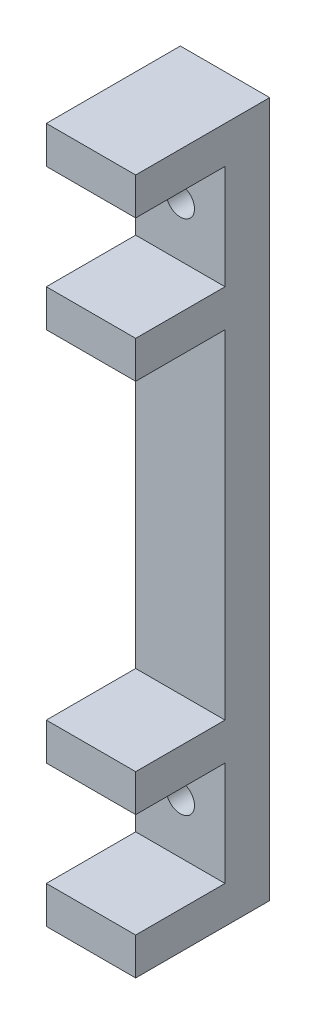
ISO-10303-21;
HEADER;
FILE_DESCRIPTION(('STEP AP214'),'2;1');
FILE_NAME('part.step','',(''),(''),'','','');
FILE_SCHEMA(('AUTOMOTIVE_DESIGN { 1 0 10303 214 1 1 1 1 }'));
ENDSEC;
DATA;
#1=APPLICATION_CONTEXT('core data for automotive mechanical design processes');
#2=APPLICATION_PROTOCOL_DEFINITION('international standard','automotive_design',2000,#1);
#3=PRODUCT_CONTEXT('',#1,'mechanical');
#4=PRODUCT('Part','Part','',(#3));
#5=PRODUCT_RELATED_PRODUCT_CATEGORY('part','',(#4));
#6=PRODUCT_DEFINITION_FORMATION('','',#4);
#7=PRODUCT_DEFINITION_CONTEXT('part definition',#1,'design');
#8=PRODUCT_DEFINITION('design','',#6,#7);
#9=PRODUCT_DEFINITION_SHAPE('','',#8);
#10=(LENGTH_UNIT() NAMED_UNIT(*) SI_UNIT(.MILLI.,.METRE.));
#11=(NAMED_UNIT(*) PLANE_ANGLE_UNIT() SI_UNIT($,.RADIAN.));
#12=(NAMED_UNIT(*) SI_UNIT($,.STERADIAN.) SOLID_ANGLE_UNIT());
#13=UNCERTAINTY_MEASURE_WITH_UNIT(LENGTH_MEASURE(1.E-05),#10,'distance_accuracy_value','');
#14=(GEOMETRIC_REPRESENTATION_CONTEXT(3) GLOBAL_UNCERTAINTY_ASSIGNED_CONTEXT((#13)) GLOBAL_UNIT_ASSIGNED_CONTEXT((#10,
#11,#12)) REPRESENTATION_CONTEXT('',''));
#15=CARTESIAN_POINT('',(0.,0.,0.));
#16=DIRECTION('',(0.,0.,1.));
#17=DIRECTION('',(1.,0.,0.));
#18=AXIS2_PLACEMENT_3D('',#15,#16,#17);
#19=CARTESIAN_POINT('',(0.,0.,3.));
#20=DIRECTION('',(0.,0.,-1.));
#21=DIRECTION('',(-1.,0.,0.));
#22=AXIS2_PLACEMENT_3D('',#19,#20,#21);
#23=PLANE('',#22);
#24=DIRECTION('',(0.,1.,0.));
#25=VECTOR('',#24,1.);
#26=CARTESIAN_POINT('',(3.,-4.,3.));
#27=LINE('',#26,#25);
#28=CARTESIAN_POINT('',(3.00000000000001,6.00000000000001,3.));
#29=VERTEX_POINT('',#28);
#30=CARTESIAN_POINT('',(3.,28.7,3.));
#31=VERTEX_POINT('',#30);
#32=EDGE_CURVE('E42',#29,#31,#27,.T.);
#33=ORIENTED_EDGE('',*,*,#32,.T.);
#34=DIRECTION('',(-1.,0.,0.));
#35=VECTOR('',#34,1.);
#36=CARTESIAN_POINT('',(0.,28.7,3.));
#37=LINE('',#36,#35);
#38=CARTESIAN_POINT('',(-3.,28.7,3.));
#39=VERTEX_POINT('',#38);
#40=EDGE_CURVE('E205',#31,#39,#37,.T.);
#41=ORIENTED_EDGE('',*,*,#40,.T.);
#42=DIRECTION('',(0.,-1.,0.));
#43=VECTOR('',#42,1.);
#44=CARTESIAN_POINT('',(-3.,-4.,3.));
#45=LINE('',#44,#43);
#46=CARTESIAN_POINT('',(-2.99999999999999,6.,3.));
#47=VERTEX_POINT('',#46);
#48=EDGE_CURVE('E272',#39,#47,#45,.T.);
#49=ORIENTED_EDGE('',*,*,#48,.T.);
#50=DIRECTION('',(1.,0.,0.));
#51=VECTOR('',#50,1.);
#52=CARTESIAN_POINT('',(0.,6.,3.));
#53=LINE('',#52,#51);
#54=EDGE_CURVE('E231',#47,#29,#53,.T.);
#55=ORIENTED_EDGE('',*,*,#54,.T.);
#56=EDGE_LOOP('',(#33,#41,#49,#55));
#57=FACE_BOUND('',#56,.T.);
#58=ADVANCED_FACE('F33',(#57),#23,.F.);
#59=CARTESIAN_POINT('',(0.,34.7,3.));
#60=DIRECTION('',(0.,0.,1.));
#61=DIRECTION('',(1.,0.,0.));
#62=AXIS2_PLACEMENT_3D('',#59,#60,#61);
#63=CIRCLE('',#62,0.95);
#64=CARTESIAN_POINT('',(0.95,34.7,3.));
#65=VERTEX_POINT('',#64);
#66=EDGE_CURVE('E260',#65,#65,#63,.T.);
#67=ORIENTED_EDGE('',*,*,#66,.F.);
#68=EDGE_LOOP('',(#67));
#69=FACE_BOUND('',#68,.T.);
#70=CARTESIAN_POINT('',(-3.,38.2,3.));
#71=VERTEX_POINT('',#70);
#72=CARTESIAN_POINT('',(-3.,31.2,3.));
#73=VERTEX_POINT('',#72);
#74=EDGE_CURVE('E51',#71,#73,#45,.T.);
#75=ORIENTED_EDGE('',*,*,#74,.T.);
#76=DIRECTION('',(1.,0.,0.));
#77=VECTOR('',#76,1.);
#78=CARTESIAN_POINT('',(0.,31.2,3.));
#79=LINE('',#78,#77);
#80=CARTESIAN_POINT('',(3.,31.2,3.));
#81=VERTEX_POINT('',#80);
#82=EDGE_CURVE('E55',#73,#81,#79,.T.);
#83=ORIENTED_EDGE('',*,*,#82,.T.);
#84=CARTESIAN_POINT('',(3.,38.2,3.));
#85=VERTEX_POINT('',#84);
#86=EDGE_CURVE('E44',#81,#85,#27,.T.);
#87=ORIENTED_EDGE('',*,*,#86,.T.);
#88=DIRECTION('',(-1.,0.,0.));
#89=VECTOR('',#88,1.);
#90=CARTESIAN_POINT('',(0.,38.2,3.));
#91=LINE('',#90,#89);
#92=EDGE_CURVE('E257',#85,#71,#91,.T.);
#93=ORIENTED_EDGE('',*,*,#92,.T.);
#94=EDGE_LOOP('',(#75,#83,#87,#93));
#95=FACE_BOUND('',#94,.T.);
#96=ADVANCED_FACE('F303',(#69,#95),#23,.F.);
#97=CARTESIAN_POINT('',(-3.,3.5,3.));
#98=VERTEX_POINT('',#97);
#99=CARTESIAN_POINT('',(-2.99999999999998,-3.5,3.));
#100=VERTEX_POINT('',#99);
#101=EDGE_CURVE('E273',#98,#100,#45,.T.);
#102=ORIENTED_EDGE('',*,*,#101,.T.);
#103=DIRECTION('',(1.,0.,0.));
#104=VECTOR('',#103,1.);
#105=CARTESIAN_POINT('',(0.,-3.5,3.));
#106=LINE('',#105,#104);
#107=CARTESIAN_POINT('',(3.00000000000002,-3.5,3.));
#108=VERTEX_POINT('',#107);
#109=EDGE_CURVE('E153',#100,#108,#106,.T.);
#110=ORIENTED_EDGE('',*,*,#109,.T.);
#111=CARTESIAN_POINT('',(3.00000000000002,3.50000000000001,3.));
#112=VERTEX_POINT('',#111);
#113=EDGE_CURVE('E11',#108,#112,#27,.T.);
#114=ORIENTED_EDGE('',*,*,#113,.T.);
#115=DIRECTION('',(-1.,0.,0.));
#116=VECTOR('',#115,1.);
#117=CARTESIAN_POINT('',(0.,3.5,3.));
#118=LINE('',#117,#116);
#119=EDGE_CURVE('E228',#112,#98,#118,.T.);
#120=ORIENTED_EDGE('',*,*,#119,.T.);
#121=EDGE_LOOP('',(#102,#110,#114,#120));
#122=FACE_BOUND('',#121,.T.);
#123=CARTESIAN_POINT('',(0.,0.,3.));
#124=DIRECTION('',(0.,0.,1.));
#125=DIRECTION('',(1.,0.,0.));
#126=AXIS2_PLACEMENT_3D('',#123,#124,#125);
#127=CIRCLE('',#126,0.95);
#128=CARTESIAN_POINT('',(0.95,0.,3.));
#129=VERTEX_POINT('',#128);
#130=EDGE_CURVE('E266',#129,#129,#127,.T.);
#131=ORIENTED_EDGE('',*,*,#130,.F.);
#132=EDGE_LOOP('',(#131));
#133=FACE_BOUND('',#132,.T.);
#134=ADVANCED_FACE('F337',(#122,#133),#23,.F.);
#135=CARTESIAN_POINT('',(0.,0.,0.));
#136=DIRECTION('',(0.,0.,-1.));
#137=DIRECTION('',(-1.,0.,0.));
#138=AXIS2_PLACEMENT_3D('',#135,#136,#137);
#139=PLANE('',#138);
#140=DIRECTION('',(-1.,0.,0.));
#141=VECTOR('',#140,1.);
#142=CARTESIAN_POINT('',(-3.00000000000001,40.7,0.));
#143=LINE('',#142,#141);
#144=CARTESIAN_POINT('',(3.,40.7,0.));
#145=VERTEX_POINT('',#144);
#146=CARTESIAN_POINT('',(-3.00000000000001,40.7,0.));
#147=VERTEX_POINT('',#146);
#148=EDGE_CURVE('E247',#145,#147,#143,.T.);
#149=ORIENTED_EDGE('',*,*,#148,.F.);
#150=DIRECTION('',(0.,1.,0.));
#151=VECTOR('',#150,1.);
#152=CARTESIAN_POINT('',(3.,-4.,0.));
#153=LINE('',#152,#151);
#154=CARTESIAN_POINT('',(3.00000000000003,-6.,0.));
#155=VERTEX_POINT('',#154);
#156=EDGE_CURVE('E37',#155,#145,#153,.T.);
#157=ORIENTED_EDGE('',*,*,#156,.F.);
#158=DIRECTION('',(1.,0.,0.));
#159=VECTOR('',#158,1.);
#160=CARTESIAN_POINT('',(-2.99999999999998,-6.00000000000001,0.));
#161=LINE('',#160,#159);
#162=CARTESIAN_POINT('',(-2.99999999999998,-6.00000000000001,0.));
#163=VERTEX_POINT('',#162);
#164=EDGE_CURVE('E176',#163,#155,#161,.T.);
#165=ORIENTED_EDGE('',*,*,#164,.F.);
#166=DIRECTION('',(0.,-1.,0.));
#167=VECTOR('',#166,1.);
#168=CARTESIAN_POINT('',(-3.,-4.,0.));
#169=LINE('',#168,#167);
#170=EDGE_CURVE('E269',#147,#163,#169,.T.);
#171=ORIENTED_EDGE('',*,*,#170,.F.);
#172=EDGE_LOOP('',(#149,#157,#165,#171));
#173=FACE_BOUND('',#172,.T.);
#174=CARTESIAN_POINT('',(0.,34.7,0.));
#175=DIRECTION('',(0.,0.,1.));
#176=DIRECTION('',(1.,0.,0.));
#177=AXIS2_PLACEMENT_3D('',#174,#175,#176);
#178=CIRCLE('',#177,0.95);
#179=CARTESIAN_POINT('',(0.95,34.7,0.));
#180=VERTEX_POINT('',#179);
#181=EDGE_CURVE('E259',#180,#180,#178,.T.);
#182=ORIENTED_EDGE('',*,*,#181,.T.);
#183=EDGE_LOOP('',(#182));
#184=FACE_BOUND('',#183,.T.);
#185=CARTESIAN_POINT('',(0.,0.,0.));
#186=DIRECTION('',(0.,0.,1.));
#187=DIRECTION('',(1.,0.,0.));
#188=AXIS2_PLACEMENT_3D('',#185,#186,#187);
#189=CIRCLE('',#188,0.95);
#190=CARTESIAN_POINT('',(0.95,0.,0.));
#191=VERTEX_POINT('',#190);
#192=EDGE_CURVE('E263',#191,#191,#189,.T.);
#193=ORIENTED_EDGE('',*,*,#192,.T.);
#194=EDGE_LOOP('',(#193));
#195=FACE_BOUND('',#194,.T.);
#196=ADVANCED_FACE('F345',(#173,#184,#195),#139,.T.);
#197=CARTESIAN_POINT('',(-3.,-4.,3.));
#198=DIRECTION('',(1.,0.,0.));
#199=DIRECTION('',(0.,0.,-1.));
#200=AXIS2_PLACEMENT_3D('',#197,#198,#199);
#201=PLANE('',#200);
#202=DIRECTION('',(0.,0.,1.));
#203=VECTOR('',#202,1.);
#204=CARTESIAN_POINT('',(-2.99999999999998,-3.5,-6.50000000000001));
#205=LINE('',#204,#203);
#206=CARTESIAN_POINT('',(-2.99999999999998,-3.5,9.));
#207=VERTEX_POINT('',#206);
#208=EDGE_CURVE('E147',#100,#207,#205,.T.);
#209=ORIENTED_EDGE('',*,*,#208,.F.);
#210=ORIENTED_EDGE('',*,*,#101,.F.);
#211=DIRECTION('',(0.,0.,1.));
#212=VECTOR('',#211,1.);
#213=CARTESIAN_POINT('',(-2.99999999999998,3.5,-6.50000000000001));
#214=LINE('',#213,#212);
#215=CARTESIAN_POINT('',(-2.99999999999998,3.5,9.));
#216=VERTEX_POINT('',#215);
#217=EDGE_CURVE('E221',#98,#216,#214,.T.);
#218=ORIENTED_EDGE('',*,*,#217,.T.);
#219=DIRECTION('',(0.,-1.,0.));
#220=VECTOR('',#219,1.);
#221=CARTESIAN_POINT('',(-2.99999999999998,3.5,9.));
#222=LINE('',#221,#220);
#223=CARTESIAN_POINT('',(-2.99999999999999,6.,9.));
#224=VERTEX_POINT('',#223);
#225=EDGE_CURVE('E217',#224,#216,#222,.T.);
#226=ORIENTED_EDGE('',*,*,#225,.F.);
#227=DIRECTION('',(0.,0.,1.));
#228=VECTOR('',#227,1.);
#229=CARTESIAN_POINT('',(-2.99999999999999,6.,-6.50000000000001));
#230=LINE('',#229,#228);
#231=EDGE_CURVE('E224',#47,#224,#230,.T.);
#232=ORIENTED_EDGE('',*,*,#231,.F.);
#233=ORIENTED_EDGE('',*,*,#48,.F.);
#234=DIRECTION('',(0.,0.,1.));
#235=VECTOR('',#234,1.);
#236=CARTESIAN_POINT('',(-3.,28.7,-6.50000000000001));
#237=LINE('',#236,#235);
#238=CARTESIAN_POINT('',(-3.,28.7,9.));
#239=VERTEX_POINT('',#238);
#240=EDGE_CURVE('E199',#39,#239,#237,.T.);
#241=ORIENTED_EDGE('',*,*,#240,.T.);
#242=DIRECTION('',(0.,-1.,0.));
#243=VECTOR('',#242,1.);
#244=CARTESIAN_POINT('',(-3.,31.2,9.));
#245=LINE('',#244,#243);
#246=CARTESIAN_POINT('',(-3.,31.2,9.));
#247=VERTEX_POINT('',#246);
#248=EDGE_CURVE('E184',#247,#239,#245,.T.);
#249=ORIENTED_EDGE('',*,*,#248,.F.);
#250=DIRECTION('',(0.,0.,1.));
#251=VECTOR('',#250,1.);
#252=CARTESIAN_POINT('',(-3.,31.2,-6.50000000000001));
#253=LINE('',#252,#251);
#254=EDGE_CURVE('E197',#73,#247,#253,.T.);
#255=ORIENTED_EDGE('',*,*,#254,.F.);
#256=ORIENTED_EDGE('',*,*,#74,.F.);
#257=DIRECTION('',(0.,0.,1.));
#258=VECTOR('',#257,1.);
#259=CARTESIAN_POINT('',(-3.,38.2,-6.50000000000001));
#260=LINE('',#259,#258);
#261=CARTESIAN_POINT('',(-3.,38.2,9.));
#262=VERTEX_POINT('',#261);
#263=EDGE_CURVE('E253',#71,#262,#260,.T.);
#264=ORIENTED_EDGE('',*,*,#263,.T.);
#265=DIRECTION('',(0.,-1.,0.));
#266=VECTOR('',#265,1.);
#267=CARTESIAN_POINT('',(-3.,38.2,9.));
#268=LINE('',#267,#266);
#269=CARTESIAN_POINT('',(-3.00000000000001,40.7,9.));
#270=VERTEX_POINT('',#269);
#271=EDGE_CURVE('E234',#270,#262,#268,.T.);
#272=ORIENTED_EDGE('',*,*,#271,.F.);
#273=DIRECTION('',(0.,0.,1.));
#274=VECTOR('',#273,1.);
#275=CARTESIAN_POINT('',(-3.00000000000001,40.7,-6.50000000000001));
#276=LINE('',#275,#274);
#277=EDGE_CURVE('E250',#147,#270,#276,.T.);
#278=ORIENTED_EDGE('',*,*,#277,.F.);
#279=ORIENTED_EDGE('',*,*,#170,.T.);
#280=DIRECTION('',(0.,0.,1.));
#281=VECTOR('',#280,1.);
#282=CARTESIAN_POINT('',(-2.99999999999998,-6.00000000000001,-6.50000000000001));
#283=LINE('',#282,#281);
#284=CARTESIAN_POINT('',(-2.99999999999998,-6.00000000000001,9.));
#285=VERTEX_POINT('',#284);
#286=EDGE_CURVE('E162',#163,#285,#283,.T.);
#287=ORIENTED_EDGE('',*,*,#286,.T.);
#288=DIRECTION('',(0.,-1.,0.));
#289=VECTOR('',#288,1.);
#290=CARTESIAN_POINT('',(-2.99999999999998,-3.5,9.));
#291=LINE('',#290,#289);
#292=EDGE_CURVE('E160',#207,#285,#291,.T.);
#293=ORIENTED_EDGE('',*,*,#292,.F.);
#294=EDGE_LOOP('',(#209,#210,#218,#226,#232,#233,#241,#249,#255,#256,#264,#272,#278,#279,#287,#293));
#295=FACE_BOUND('',#294,.T.);
#296=ADVANCED_FACE('F35',(#295),#201,.F.);
#297=CARTESIAN_POINT('',(3.,-4.,3.));
#298=DIRECTION('',(-1.,0.,0.));
#299=DIRECTION('',(0.,0.,1.));
#300=AXIS2_PLACEMENT_3D('',#297,#298,#299);
#301=PLANE('',#300);
#302=ORIENTED_EDGE('',*,*,#113,.F.);
#303=DIRECTION('',(0.,0.,1.));
#304=VECTOR('',#303,1.);
#305=CARTESIAN_POINT('',(3.00000000000002,-3.5,-6.50000000000001));
#306=LINE('',#305,#304);
#307=CARTESIAN_POINT('',(3.00000000000002,-3.5,9.));
#308=VERTEX_POINT('',#307);
#309=EDGE_CURVE('E157',#108,#308,#306,.T.);
#310=ORIENTED_EDGE('',*,*,#309,.T.);
#311=DIRECTION('',(0.,1.,0.));
#312=VECTOR('',#311,1.);
#313=CARTESIAN_POINT('',(3.00000000000002,-3.5,9.));
#314=LINE('',#313,#312);
#315=CARTESIAN_POINT('',(3.00000000000003,-6.,9.));
#316=VERTEX_POINT('',#315);
#317=EDGE_CURVE('E171',#316,#308,#314,.T.);
#318=ORIENTED_EDGE('',*,*,#317,.F.);
#319=DIRECTION('',(0.,0.,1.));
#320=VECTOR('',#319,1.);
#321=CARTESIAN_POINT('',(3.00000000000003,-6.,-6.50000000000001));
#322=LINE('',#321,#320);
#323=EDGE_CURVE('E179',#155,#316,#322,.T.);
#324=ORIENTED_EDGE('',*,*,#323,.F.);
#325=ORIENTED_EDGE('',*,*,#156,.T.);
#326=DIRECTION('',(0.,0.,1.));
#327=VECTOR('',#326,1.);
#328=CARTESIAN_POINT('',(3.,40.7,-6.50000000000001));
#329=LINE('',#328,#327);
#330=CARTESIAN_POINT('',(3.,40.7,9.));
#331=VERTEX_POINT('',#330);
#332=EDGE_CURVE('E251',#145,#331,#329,.T.);
#333=ORIENTED_EDGE('',*,*,#332,.T.);
#334=DIRECTION('',(0.,1.,0.));
#335=VECTOR('',#334,1.);
#336=CARTESIAN_POINT('',(3.,38.2,9.));
#337=LINE('',#336,#335);
#338=CARTESIAN_POINT('',(3.,38.2,9.));
#339=VERTEX_POINT('',#338);
#340=EDGE_CURVE('E240',#339,#331,#337,.T.);
#341=ORIENTED_EDGE('',*,*,#340,.F.);
#342=DIRECTION('',(0.,0.,1.));
#343=VECTOR('',#342,1.);
#344=CARTESIAN_POINT('',(3.,38.2,-6.50000000000001));
#345=LINE('',#344,#343);
#346=EDGE_CURVE('E246',#85,#339,#345,.T.);
#347=ORIENTED_EDGE('',*,*,#346,.F.);
#348=ORIENTED_EDGE('',*,*,#86,.F.);
#349=DIRECTION('',(0.,0.,1.));
#350=VECTOR('',#349,1.);
#351=CARTESIAN_POINT('',(3.,31.2,-6.50000000000001));
#352=LINE('',#351,#350);
#353=CARTESIAN_POINT('',(3.,31.2,9.));
#354=VERTEX_POINT('',#353);
#355=EDGE_CURVE('E200',#81,#354,#352,.T.);
#356=ORIENTED_EDGE('',*,*,#355,.T.);
#357=DIRECTION('',(0.,1.,0.));
#358=VECTOR('',#357,1.);
#359=CARTESIAN_POINT('',(3.,31.2,9.));
#360=LINE('',#359,#358);
#361=CARTESIAN_POINT('',(3.,28.7,9.));
#362=VERTEX_POINT('',#361);
#363=EDGE_CURVE('E190',#362,#354,#360,.T.);
#364=ORIENTED_EDGE('',*,*,#363,.F.);
#365=DIRECTION('',(0.,0.,1.));
#366=VECTOR('',#365,1.);
#367=CARTESIAN_POINT('',(3.,28.7,-6.50000000000001));
#368=LINE('',#367,#366);
#369=EDGE_CURVE('E196',#31,#362,#368,.T.);
#370=ORIENTED_EDGE('',*,*,#369,.F.);
#371=ORIENTED_EDGE('',*,*,#32,.F.);
#372=DIRECTION('',(0.,0.,1.));
#373=VECTOR('',#372,1.);
#374=CARTESIAN_POINT('',(3.00000000000001,6.00000000000001,-6.50000000000001));
#375=LINE('',#374,#373);
#376=CARTESIAN_POINT('',(3.00000000000001,6.00000000000001,9.));
#377=VERTEX_POINT('',#376);
#378=EDGE_CURVE('E220',#29,#377,#375,.T.);
#379=ORIENTED_EDGE('',*,*,#378,.T.);
#380=DIRECTION('',(0.,1.,0.));
#381=VECTOR('',#380,1.);
#382=CARTESIAN_POINT('',(3.00000000000002,3.50000000000001,9.));
#383=LINE('',#382,#381);
#384=CARTESIAN_POINT('',(3.00000000000002,3.50000000000001,9.));
#385=VERTEX_POINT('',#384);
#386=EDGE_CURVE('E211',#385,#377,#383,.T.);
#387=ORIENTED_EDGE('',*,*,#386,.F.);
#388=DIRECTION('',(0.,0.,1.));
#389=VECTOR('',#388,1.);
#390=CARTESIAN_POINT('',(3.00000000000002,3.50000000000001,-6.50000000000001));
#391=LINE('',#390,#389);
#392=EDGE_CURVE('E223',#112,#385,#391,.T.);
#393=ORIENTED_EDGE('',*,*,#392,.F.);
#394=EDGE_LOOP('',(#302,#310,#318,#324,#325,#333,#341,#347,#348,#356,#364,#370,#371,#379,#387,#393));
#395=FACE_BOUND('',#394,.T.);
#396=ADVANCED_FACE('F299',(#395),#301,.F.);
#397=CARTESIAN_POINT('',(0.,0.,3.));
#398=DIRECTION('',(0.,0.,-1.));
#399=DIRECTION('',(-1.,0.,0.));
#400=AXIS2_PLACEMENT_3D('',#397,#398,#399);
#401=CYLINDRICAL_SURFACE('',#400,0.95);
#402=ORIENTED_EDGE('',*,*,#130,.T.);
#403=EDGE_LOOP('',(#402));
#404=FACE_BOUND('',#403,.T.);
#405=ORIENTED_EDGE('',*,*,#192,.F.);
#406=EDGE_LOOP('',(#405));
#407=FACE_BOUND('',#406,.T.);
#408=ADVANCED_FACE('F353',(#404,#407),#401,.F.);
#409=CARTESIAN_POINT('',(0.,34.7,3.));
#410=DIRECTION('',(0.,0.,-1.));
#411=DIRECTION('',(-1.,0.,0.));
#412=AXIS2_PLACEMENT_3D('',#409,#410,#411);
#413=CYLINDRICAL_SURFACE('',#412,0.95);
#414=ORIENTED_EDGE('',*,*,#66,.T.);
#415=EDGE_LOOP('',(#414));
#416=FACE_BOUND('',#415,.T.);
#417=ORIENTED_EDGE('',*,*,#181,.F.);
#418=EDGE_LOOP('',(#417));
#419=FACE_BOUND('',#418,.T.);
#420=ADVANCED_FACE('F356',(#416,#419),#413,.F.);
#421=CARTESIAN_POINT('',(-3.,38.2,-6.50000000000001));
#422=DIRECTION('',(0.,-1.,0.));
#423=DIRECTION('',(0.,0.,-1.));
#424=AXIS2_PLACEMENT_3D('',#421,#422,#423);
#425=PLANE('',#424);
#426=ORIENTED_EDGE('',*,*,#92,.F.);
#427=ORIENTED_EDGE('',*,*,#346,.T.);
#428=DIRECTION('',(1.,0.,0.));
#429=VECTOR('',#428,1.);
#430=CARTESIAN_POINT('',(-3.,38.2,9.));
#431=LINE('',#430,#429);
#432=EDGE_CURVE('E237',#262,#339,#431,.T.);
#433=ORIENTED_EDGE('',*,*,#432,.F.);
#434=ORIENTED_EDGE('',*,*,#263,.F.);
#435=EDGE_LOOP('',(#426,#427,#433,#434));
#436=FACE_BOUND('',#435,.T.);
#437=ADVANCED_FACE('F307',(#436),#425,.T.);
#438=CARTESIAN_POINT('',(-3.00000000000001,40.7,-6.50000000000001));
#439=DIRECTION('',(0.,1.,0.));
#440=DIRECTION('',(0.,0.,1.));
#441=AXIS2_PLACEMENT_3D('',#438,#439,#440);
#442=PLANE('',#441);
#443=ORIENTED_EDGE('',*,*,#332,.F.);
#444=ORIENTED_EDGE('',*,*,#148,.T.);
#445=ORIENTED_EDGE('',*,*,#277,.T.);
#446=DIRECTION('',(-1.,0.,0.));
#447=VECTOR('',#446,1.);
#448=CARTESIAN_POINT('',(-3.00000000000001,40.7,9.));
#449=LINE('',#448,#447);
#450=EDGE_CURVE('E243',#331,#270,#449,.T.);
#451=ORIENTED_EDGE('',*,*,#450,.F.);
#452=EDGE_LOOP('',(#443,#444,#445,#451));
#453=FACE_BOUND('',#452,.T.);
#454=ADVANCED_FACE('F316',(#453),#442,.T.);
#455=CARTESIAN_POINT('',(0.,0.,9.));
#456=DIRECTION('',(0.,0.,-1.));
#457=DIRECTION('',(-1.,0.,0.));
#458=AXIS2_PLACEMENT_3D('',#455,#456,#457);
#459=PLANE('',#458);
#460=ORIENTED_EDGE('',*,*,#271,.T.);
#461=ORIENTED_EDGE('',*,*,#432,.T.);
#462=ORIENTED_EDGE('',*,*,#340,.T.);
#463=ORIENTED_EDGE('',*,*,#450,.T.);
#464=EDGE_LOOP('',(#460,#461,#462,#463));
#465=FACE_BOUND('',#464,.T.);
#466=ADVANCED_FACE('F313',(#465),#459,.F.);
#467=CARTESIAN_POINT('',(-2.99999999999999,6.,-6.50000000000001));
#468=DIRECTION('',(0.,1.,0.));
#469=DIRECTION('',(-1.,0.,0.));
#470=AXIS2_PLACEMENT_3D('',#467,#468,#469);
#471=PLANE('',#470);
#472=ORIENTED_EDGE('',*,*,#54,.F.);
#473=ORIENTED_EDGE('',*,*,#231,.T.);
#474=DIRECTION('',(-1.,0.,0.));
#475=VECTOR('',#474,1.);
#476=CARTESIAN_POINT('',(-2.99999999999999,6.,9.));
#477=LINE('',#476,#475);
#478=EDGE_CURVE('E214',#377,#224,#477,.T.);
#479=ORIENTED_EDGE('',*,*,#478,.F.);
#480=ORIENTED_EDGE('',*,*,#378,.F.);
#481=EDGE_LOOP('',(#472,#473,#479,#480));
#482=FACE_BOUND('',#481,.T.);
#483=ADVANCED_FACE('F287',(#482),#471,.T.);
#484=CARTESIAN_POINT('',(-2.99999999999998,3.5,-6.50000000000001));
#485=DIRECTION('',(0.,-1.,0.));
#486=DIRECTION('',(1.,0.,0.));
#487=AXIS2_PLACEMENT_3D('',#484,#485,#486);
#488=PLANE('',#487);
#489=ORIENTED_EDGE('',*,*,#119,.F.);
#490=ORIENTED_EDGE('',*,*,#392,.T.);
#491=DIRECTION('',(1.,0.,0.));
#492=VECTOR('',#491,1.);
#493=CARTESIAN_POINT('',(-2.99999999999998,3.5,9.));
#494=LINE('',#493,#492);
#495=EDGE_CURVE('E208',#216,#385,#494,.T.);
#496=ORIENTED_EDGE('',*,*,#495,.F.);
#497=ORIENTED_EDGE('',*,*,#217,.F.);
#498=EDGE_LOOP('',(#489,#490,#496,#497));
#499=FACE_BOUND('',#498,.T.);
#500=ADVANCED_FACE('F295',(#499),#488,.T.);
#501=CARTESIAN_POINT('',(0.,0.,9.));
#502=DIRECTION('',(0.,0.,1.));
#503=DIRECTION('',(1.,0.,0.));
#504=AXIS2_PLACEMENT_3D('',#501,#502,#503);
#505=PLANE('',#504);
#506=ORIENTED_EDGE('',*,*,#495,.T.);
#507=ORIENTED_EDGE('',*,*,#386,.T.);
#508=ORIENTED_EDGE('',*,*,#478,.T.);
#509=ORIENTED_EDGE('',*,*,#225,.T.);
#510=EDGE_LOOP('',(#506,#507,#508,#509));
#511=FACE_BOUND('',#510,.T.);
#512=ADVANCED_FACE('F292',(#511),#505,.T.);
#513=CARTESIAN_POINT('',(-3.,28.7,-6.50000000000001));
#514=DIRECTION('',(0.,-1.,0.));
#515=DIRECTION('',(0.,0.,-1.));
#516=AXIS2_PLACEMENT_3D('',#513,#514,#515);
#517=PLANE('',#516);
#518=ORIENTED_EDGE('',*,*,#40,.F.);
#519=ORIENTED_EDGE('',*,*,#369,.T.);
#520=DIRECTION('',(1.,0.,0.));
#521=VECTOR('',#520,1.);
#522=CARTESIAN_POINT('',(-3.,28.7,9.));
#523=LINE('',#522,#521);
#524=EDGE_CURVE('E187',#239,#362,#523,.T.);
#525=ORIENTED_EDGE('',*,*,#524,.F.);
#526=ORIENTED_EDGE('',*,*,#240,.F.);
#527=EDGE_LOOP('',(#518,#519,#525,#526));
#528=FACE_BOUND('',#527,.T.);
#529=ADVANCED_FACE('F326',(#528),#517,.T.);
#530=CARTESIAN_POINT('',(-3.,31.2,-6.50000000000001));
#531=DIRECTION('',(0.,1.,0.));
#532=DIRECTION('',(0.,0.,1.));
#533=AXIS2_PLACEMENT_3D('',#530,#531,#532);
#534=PLANE('',#533);
#535=ORIENTED_EDGE('',*,*,#82,.F.);
#536=ORIENTED_EDGE('',*,*,#254,.T.);
#537=DIRECTION('',(-1.,0.,0.));
#538=VECTOR('',#537,1.);
#539=CARTESIAN_POINT('',(-3.,31.2,9.));
#540=LINE('',#539,#538);
#541=EDGE_CURVE('E193',#354,#247,#540,.T.);
#542=ORIENTED_EDGE('',*,*,#541,.F.);
#543=ORIENTED_EDGE('',*,*,#355,.F.);
#544=EDGE_LOOP('',(#535,#536,#542,#543));
#545=FACE_BOUND('',#544,.T.);
#546=ADVANCED_FACE('F321',(#545),#534,.T.);
#547=CARTESIAN_POINT('',(0.,0.,9.));
#548=DIRECTION('',(0.,0.,1.));
#549=DIRECTION('',(1.,0.,0.));
#550=AXIS2_PLACEMENT_3D('',#547,#548,#549);
#551=PLANE('',#550);
#552=ORIENTED_EDGE('',*,*,#248,.T.);
#553=ORIENTED_EDGE('',*,*,#524,.T.);
#554=ORIENTED_EDGE('',*,*,#363,.T.);
#555=ORIENTED_EDGE('',*,*,#541,.T.);
#556=EDGE_LOOP('',(#552,#553,#554,#555));
#557=FACE_BOUND('',#556,.T.);
#558=ADVANCED_FACE('F323',(#557),#551,.T.);
#559=CARTESIAN_POINT('',(-2.99999999999998,-3.5,-6.50000000000001));
#560=DIRECTION('',(0.,1.,0.));
#561=DIRECTION('',(-1.,0.,0.));
#562=AXIS2_PLACEMENT_3D('',#559,#560,#561);
#563=PLANE('',#562);
#564=ORIENTED_EDGE('',*,*,#109,.F.);
#565=ORIENTED_EDGE('',*,*,#208,.T.);
#566=DIRECTION('',(-1.,0.,0.));
#567=VECTOR('',#566,1.);
#568=CARTESIAN_POINT('',(-2.99999999999998,-3.5,9.));
#569=LINE('',#568,#567);
#570=EDGE_CURVE('E151',#308,#207,#569,.T.);
#571=ORIENTED_EDGE('',*,*,#570,.F.);
#572=ORIENTED_EDGE('',*,*,#309,.F.);
#573=EDGE_LOOP('',(#564,#565,#571,#572));
#574=FACE_BOUND('',#573,.T.);
#575=ADVANCED_FACE('F149',(#574),#563,.T.);
#576=CARTESIAN_POINT('',(-2.99999999999998,-6.00000000000001,-6.50000000000001));
#577=DIRECTION('',(0.,-1.,0.));
#578=DIRECTION('',(1.,0.,0.));
#579=AXIS2_PLACEMENT_3D('',#576,#577,#578);
#580=PLANE('',#579);
#581=ORIENTED_EDGE('',*,*,#286,.F.);
#582=ORIENTED_EDGE('',*,*,#164,.T.);
#583=ORIENTED_EDGE('',*,*,#323,.T.);
#584=DIRECTION('',(1.,0.,0.));
#585=VECTOR('',#584,1.);
#586=CARTESIAN_POINT('',(-2.99999999999998,-6.00000000000001,9.));
#587=LINE('',#586,#585);
#588=EDGE_CURVE('E166',#285,#316,#587,.T.);
#589=ORIENTED_EDGE('',*,*,#588,.F.);
#590=EDGE_LOOP('',(#581,#582,#583,#589));
#591=FACE_BOUND('',#590,.T.);
#592=ADVANCED_FACE('F410',(#591),#580,.T.);
#593=CARTESIAN_POINT('',(0.,0.,9.));
#594=DIRECTION('',(0.,0.,-1.));
#595=DIRECTION('',(-1.,0.,0.));
#596=AXIS2_PLACEMENT_3D('',#593,#594,#595);
#597=PLANE('',#596);
#598=ORIENTED_EDGE('',*,*,#570,.T.);
#599=ORIENTED_EDGE('',*,*,#292,.T.);
#600=ORIENTED_EDGE('',*,*,#588,.T.);
#601=ORIENTED_EDGE('',*,*,#317,.T.);
#602=EDGE_LOOP('',(#598,#599,#600,#601));
#603=FACE_BOUND('',#602,.T.);
#604=ADVANCED_FACE('F169',(#603),#597,.F.);
#605=CLOSED_SHELL('',(#58,#96,#134,#196,#296,#396,#408,#420,#437,#454,#466,#483,#500,#512,#529,
#546,#558,#575,#592,#604));
#606=MANIFOLD_SOLID_BREP('B2',#605);
#607=ADVANCED_BREP_SHAPE_REPRESENTATION('',(#18,#606),#14);
#608=SHAPE_DEFINITION_REPRESENTATION(#9,#607);
ENDSEC;
END-ISO-10303-21;
